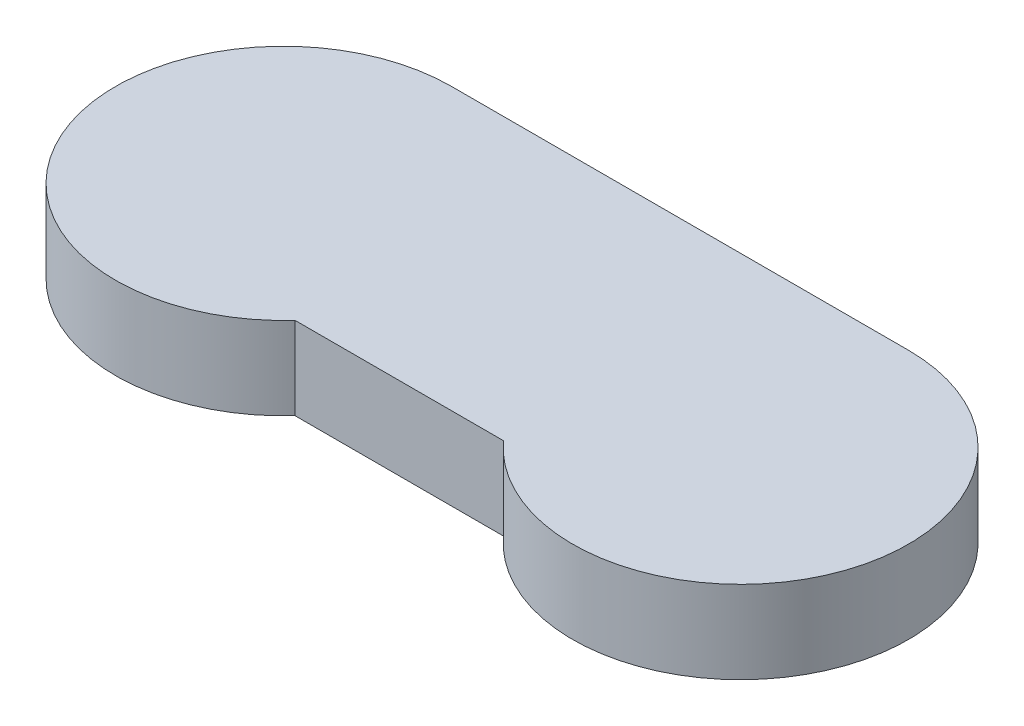
ISO-10303-21;
HEADER;
FILE_DESCRIPTION(('STEP AP214'),'2;1');
FILE_NAME('part.step','',(''),(''),'','','');
FILE_SCHEMA(('AUTOMOTIVE_DESIGN { 1 0 10303 214 1 1 1 1 }'));
ENDSEC;
DATA;
#1=APPLICATION_CONTEXT('core data for automotive mechanical design processes');
#2=APPLICATION_PROTOCOL_DEFINITION('international standard','automotive_design',2000,#1);
#3=PRODUCT_CONTEXT('',#1,'mechanical');
#4=PRODUCT('Part','Part','',(#3));
#5=PRODUCT_RELATED_PRODUCT_CATEGORY('part','',(#4));
#6=PRODUCT_DEFINITION_FORMATION('','',#4);
#7=PRODUCT_DEFINITION_CONTEXT('part definition',#1,'design');
#8=PRODUCT_DEFINITION('design','',#6,#7);
#9=PRODUCT_DEFINITION_SHAPE('','',#8);
#10=(LENGTH_UNIT() NAMED_UNIT(*) SI_UNIT(.MILLI.,.METRE.));
#11=(NAMED_UNIT(*) PLANE_ANGLE_UNIT() SI_UNIT($,.RADIAN.));
#12=(NAMED_UNIT(*) SI_UNIT($,.STERADIAN.) SOLID_ANGLE_UNIT());
#13=UNCERTAINTY_MEASURE_WITH_UNIT(LENGTH_MEASURE(1.E-05),#10,'distance_accuracy_value','');
#14=(GEOMETRIC_REPRESENTATION_CONTEXT(3) GLOBAL_UNCERTAINTY_ASSIGNED_CONTEXT((#13)) GLOBAL_UNIT_ASSIGNED_CONTEXT((#10,
#11,#12)) REPRESENTATION_CONTEXT('',''));
#15=CARTESIAN_POINT('',(0.,0.,0.));
#16=DIRECTION('',(0.,0.,1.));
#17=DIRECTION('',(1.,0.,0.));
#18=AXIS2_PLACEMENT_3D('',#15,#16,#17);
#19=CARTESIAN_POINT('',(-41.5000000000001,0.,0.));
#20=DIRECTION('',(0.,1.,0.));
#21=DIRECTION('',(0.,0.,1.));
#22=AXIS2_PLACEMENT_3D('',#19,#20,#21);
#23=PLANE('',#22);
#24=CARTESIAN_POINT('',(-41.5000000000001,0.,0.));
#25=DIRECTION('',(0.,1.,0.));
#26=DIRECTION('',(0.,0.,1.));
#27=AXIS2_PLACEMENT_3D('',#24,#25,#26);
#28=CIRCLE('',#27,30.5);
#29=CARTESIAN_POINT('',(-41.5000000000001,0.,-30.5));
#30=VERTEX_POINT('',#29);
#31=CARTESIAN_POINT('',(-18.9168204187277,0.,20.5));
#32=VERTEX_POINT('',#31);
#33=EDGE_CURVE('E127',#30,#32,#28,.T.);
#34=ORIENTED_EDGE('',*,*,#33,.F.);
#35=DIRECTION('',(-1.,0.,0.));
#36=VECTOR('',#35,1.);
#37=CARTESIAN_POINT('',(41.4999999999999,0.,-30.5));
#38=LINE('',#37,#36);
#39=CARTESIAN_POINT('',(41.4999999999999,0.,-30.5));
#40=VERTEX_POINT('',#39);
#41=EDGE_CURVE('E78',#40,#30,#38,.T.);
#42=ORIENTED_EDGE('',*,*,#41,.F.);
#43=CARTESIAN_POINT('',(41.4999999999999,0.,0.));
#44=DIRECTION('',(0.,1.,0.));
#45=DIRECTION('',(0.,0.,1.));
#46=AXIS2_PLACEMENT_3D('',#43,#44,#45);
#47=CIRCLE('',#46,30.5);
#48=CARTESIAN_POINT('',(18.9168204187274,0.,20.5));
#49=VERTEX_POINT('',#48);
#50=EDGE_CURVE('E145',#49,#40,#47,.T.);
#51=ORIENTED_EDGE('',*,*,#50,.F.);
#52=DIRECTION('',(1.,0.,0.));
#53=VECTOR('',#52,1.);
#54=CARTESIAN_POINT('',(-18.9168204187277,0.,20.5));
#55=LINE('',#54,#53);
#56=EDGE_CURVE('E131',#32,#49,#55,.T.);
#57=ORIENTED_EDGE('',*,*,#56,.F.);
#58=EDGE_LOOP('',(#34,#42,#51,#57));
#59=FACE_BOUND('',#58,.T.);
#60=CARTESIAN_POINT('',(41.4999999999999,0.,0.));
#61=DIRECTION('',(0.,1.,0.));
#62=DIRECTION('',(0.,0.,1.));
#63=AXIS2_PLACEMENT_3D('',#60,#61,#62);
#64=CIRCLE('',#63,25.5);
#65=CARTESIAN_POINT('',(21.2515432686833,0.,15.5));
#66=VERTEX_POINT('',#65);
#67=CARTESIAN_POINT('',(41.4999999999999,0.,-25.5));
#68=VERTEX_POINT('',#67);
#69=EDGE_CURVE('E48',#66,#68,#64,.T.);
#70=ORIENTED_EDGE('',*,*,#69,.T.);
#71=DIRECTION('',(-1.,0.,0.));
#72=VECTOR('',#71,1.);
#73=CARTESIAN_POINT('',(41.4999999999999,0.,-25.5));
#74=LINE('',#73,#72);
#75=CARTESIAN_POINT('',(-41.5000000000001,0.,-25.5));
#76=VERTEX_POINT('',#75);
#77=EDGE_CURVE('E126',#68,#76,#74,.T.);
#78=ORIENTED_EDGE('',*,*,#77,.T.);
#79=CARTESIAN_POINT('',(-41.5000000000001,0.,0.));
#80=DIRECTION('',(0.,1.,0.));
#81=DIRECTION('',(0.,0.,1.));
#82=AXIS2_PLACEMENT_3D('',#79,#80,#81);
#83=CIRCLE('',#82,25.5);
#84=CARTESIAN_POINT('',(-21.2515432686835,0.,15.5));
#85=VERTEX_POINT('',#84);
#86=EDGE_CURVE('E259',#76,#85,#83,.T.);
#87=ORIENTED_EDGE('',*,*,#86,.T.);
#88=DIRECTION('',(1.,0.,0.));
#89=VECTOR('',#88,1.);
#90=CARTESIAN_POINT('',(-21.2515432686835,0.,15.5));
#91=LINE('',#90,#89);
#92=EDGE_CURVE('E122',#85,#66,#91,.T.);
#93=ORIENTED_EDGE('',*,*,#92,.T.);
#94=EDGE_LOOP('',(#70,#78,#87,#93));
#95=FACE_BOUND('',#94,.T.);
#96=ADVANCED_FACE('F33',(#59,#95),#23,.F.);
#97=CARTESIAN_POINT('',(-41.5000000000001,15.,0.));
#98=DIRECTION('',(0.,-1.,0.));
#99=DIRECTION('',(0.,0.,-1.));
#100=AXIS2_PLACEMENT_3D('',#97,#98,#99);
#101=CYLINDRICAL_SURFACE('',#100,30.5);
#102=ORIENTED_EDGE('',*,*,#33,.T.);
#103=DIRECTION('',(0.,-1.,0.));
#104=VECTOR('',#103,1.);
#105=CARTESIAN_POINT('',(-18.9168204187277,15.,20.5));
#106=LINE('',#105,#104);
#107=CARTESIAN_POINT('',(-18.9168204187277,15.,20.5));
#108=VERTEX_POINT('',#107);
#109=EDGE_CURVE('E11',#108,#32,#106,.T.);
#110=ORIENTED_EDGE('',*,*,#109,.F.);
#111=CARTESIAN_POINT('',(-41.5000000000001,15.,0.));
#112=DIRECTION('',(0.,1.,0.));
#113=DIRECTION('',(0.,0.,1.));
#114=AXIS2_PLACEMENT_3D('',#111,#112,#113);
#115=CIRCLE('',#114,30.5);
#116=CARTESIAN_POINT('',(-41.5000000000001,15.,-30.5));
#117=VERTEX_POINT('',#116);
#118=EDGE_CURVE('E137',#117,#108,#115,.T.);
#119=ORIENTED_EDGE('',*,*,#118,.F.);
#120=DIRECTION('',(0.,-1.,0.));
#121=VECTOR('',#120,1.);
#122=CARTESIAN_POINT('',(-41.5000000000001,15.,-30.5));
#123=LINE('',#122,#121);
#124=EDGE_CURVE('E142',#117,#30,#123,.T.);
#125=ORIENTED_EDGE('',*,*,#124,.T.);
#126=EDGE_LOOP('',(#102,#110,#119,#125));
#127=FACE_BOUND('',#126,.T.);
#128=ADVANCED_FACE('F35',(#127),#101,.T.);
#129=CARTESIAN_POINT('',(-18.9168204187277,15.,20.5));
#130=DIRECTION('',(0.,0.,-1.));
#131=DIRECTION('',(-1.,0.,0.));
#132=AXIS2_PLACEMENT_3D('',#129,#130,#131);
#133=PLANE('',#132);
#134=ORIENTED_EDGE('',*,*,#56,.T.);
#135=DIRECTION('',(0.,-1.,0.));
#136=VECTOR('',#135,1.);
#137=CARTESIAN_POINT('',(18.9168204187274,15.,20.5));
#138=LINE('',#137,#136);
#139=CARTESIAN_POINT('',(18.9168204187274,15.,20.5));
#140=VERTEX_POINT('',#139);
#141=EDGE_CURVE('E41',#140,#49,#138,.T.);
#142=ORIENTED_EDGE('',*,*,#141,.F.);
#143=DIRECTION('',(1.,0.,0.));
#144=VECTOR('',#143,1.);
#145=CARTESIAN_POINT('',(-18.9168204187277,15.,20.5));
#146=LINE('',#145,#144);
#147=EDGE_CURVE('E85',#108,#140,#146,.T.);
#148=ORIENTED_EDGE('',*,*,#147,.F.);
#149=ORIENTED_EDGE('',*,*,#109,.T.);
#150=EDGE_LOOP('',(#134,#142,#148,#149));
#151=FACE_BOUND('',#150,.T.);
#152=ADVANCED_FACE('F171',(#151),#133,.F.);
#153=CARTESIAN_POINT('',(41.4999999999999,15.,0.));
#154=DIRECTION('',(0.,-1.,0.));
#155=DIRECTION('',(0.,0.,-1.));
#156=AXIS2_PLACEMENT_3D('',#153,#154,#155);
#157=CYLINDRICAL_SURFACE('',#156,30.5);
#158=ORIENTED_EDGE('',*,*,#50,.T.);
#159=DIRECTION('',(0.,-1.,0.));
#160=VECTOR('',#159,1.);
#161=CARTESIAN_POINT('',(41.4999999999999,15.,-30.5));
#162=LINE('',#161,#160);
#163=CARTESIAN_POINT('',(41.4999999999999,15.,-30.5));
#164=VERTEX_POINT('',#163);
#165=EDGE_CURVE('E149',#164,#40,#162,.T.);
#166=ORIENTED_EDGE('',*,*,#165,.F.);
#167=CARTESIAN_POINT('',(41.4999999999999,15.,0.));
#168=DIRECTION('',(0.,1.,0.));
#169=DIRECTION('',(0.,0.,1.));
#170=AXIS2_PLACEMENT_3D('',#167,#168,#169);
#171=CIRCLE('',#170,30.5);
#172=EDGE_CURVE('E140',#140,#164,#171,.T.);
#173=ORIENTED_EDGE('',*,*,#172,.F.);
#174=ORIENTED_EDGE('',*,*,#141,.T.);
#175=EDGE_LOOP('',(#158,#166,#173,#174));
#176=FACE_BOUND('',#175,.T.);
#177=ADVANCED_FACE('F154',(#176),#157,.T.);
#178=CARTESIAN_POINT('',(41.4999999999999,15.,-30.5));
#179=DIRECTION('',(0.,0.,1.));
#180=DIRECTION('',(1.,0.,0.));
#181=AXIS2_PLACEMENT_3D('',#178,#179,#180);
#182=PLANE('',#181);
#183=ORIENTED_EDGE('',*,*,#41,.T.);
#184=ORIENTED_EDGE('',*,*,#124,.F.);
#185=DIRECTION('',(-1.,0.,0.));
#186=VECTOR('',#185,1.);
#187=CARTESIAN_POINT('',(41.4999999999999,15.,-30.5));
#188=LINE('',#187,#186);
#189=EDGE_CURVE('E57',#164,#117,#188,.T.);
#190=ORIENTED_EDGE('',*,*,#189,.F.);
#191=ORIENTED_EDGE('',*,*,#165,.T.);
#192=EDGE_LOOP('',(#183,#184,#190,#191));
#193=FACE_BOUND('',#192,.T.);
#194=ADVANCED_FACE('F162',(#193),#182,.F.);
#195=CARTESIAN_POINT('',(-41.5000000000001,15.,0.));
#196=DIRECTION('',(0.,1.,0.));
#197=DIRECTION('',(0.,0.,1.));
#198=AXIS2_PLACEMENT_3D('',#195,#196,#197);
#199=PLANE('',#198);
#200=ORIENTED_EDGE('',*,*,#118,.T.);
#201=ORIENTED_EDGE('',*,*,#147,.T.);
#202=ORIENTED_EDGE('',*,*,#172,.T.);
#203=ORIENTED_EDGE('',*,*,#189,.T.);
#204=EDGE_LOOP('',(#200,#201,#202,#203));
#205=FACE_BOUND('',#204,.T.);
#206=ADVANCED_FACE('F164',(#205),#199,.T.);
#207=CARTESIAN_POINT('',(41.4999999999999,10.,0.));
#208=DIRECTION('',(0.,-1.,0.));
#209=DIRECTION('',(0.,0.,-1.));
#210=AXIS2_PLACEMENT_3D('',#207,#208,#209);
#211=CYLINDRICAL_SURFACE('',#210,25.5);
#212=ORIENTED_EDGE('',*,*,#69,.F.);
#213=DIRECTION('',(0.,-1.,0.));
#214=VECTOR('',#213,1.);
#215=CARTESIAN_POINT('',(21.2515432686833,10.,15.5));
#216=LINE('',#215,#214);
#217=CARTESIAN_POINT('',(21.2515432686833,10.,15.5));
#218=VERTEX_POINT('',#217);
#219=EDGE_CURVE('E121',#218,#66,#216,.T.);
#220=ORIENTED_EDGE('',*,*,#219,.F.);
#221=CARTESIAN_POINT('',(41.4999999999999,10.,0.));
#222=DIRECTION('',(0.,1.,0.));
#223=DIRECTION('',(0.,0.,1.));
#224=AXIS2_PLACEMENT_3D('',#221,#222,#223);
#225=CIRCLE('',#224,25.5);
#226=CARTESIAN_POINT('',(41.4999999999999,10.,-25.5));
#227=VERTEX_POINT('',#226);
#228=EDGE_CURVE('E113',#218,#227,#225,.T.);
#229=ORIENTED_EDGE('',*,*,#228,.T.);
#230=DIRECTION('',(0.,-1.,0.));
#231=VECTOR('',#230,1.);
#232=CARTESIAN_POINT('',(41.4999999999999,10.,-25.5));
#233=LINE('',#232,#231);
#234=EDGE_CURVE('E120',#227,#68,#233,.T.);
#235=ORIENTED_EDGE('',*,*,#234,.T.);
#236=EDGE_LOOP('',(#212,#220,#229,#235));
#237=FACE_BOUND('',#236,.T.);
#238=ADVANCED_FACE('F119',(#237),#211,.F.);
#239=CARTESIAN_POINT('',(41.4999999999999,10.,-25.5));
#240=DIRECTION('',(0.,0.,1.));
#241=DIRECTION('',(1.,0.,0.));
#242=AXIS2_PLACEMENT_3D('',#239,#240,#241);
#243=PLANE('',#242);
#244=ORIENTED_EDGE('',*,*,#77,.F.);
#245=ORIENTED_EDGE('',*,*,#234,.F.);
#246=DIRECTION('',(-1.,0.,0.));
#247=VECTOR('',#246,1.);
#248=CARTESIAN_POINT('',(41.4999999999999,10.,-25.5));
#249=LINE('',#248,#247);
#250=CARTESIAN_POINT('',(-41.5000000000001,10.,-25.5));
#251=VERTEX_POINT('',#250);
#252=EDGE_CURVE('E109',#227,#251,#249,.T.);
#253=ORIENTED_EDGE('',*,*,#252,.T.);
#254=DIRECTION('',(0.,-1.,0.));
#255=VECTOR('',#254,1.);
#256=CARTESIAN_POINT('',(-41.5000000000001,10.,-25.5));
#257=LINE('',#256,#255);
#258=EDGE_CURVE('E128',#251,#76,#257,.T.);
#259=ORIENTED_EDGE('',*,*,#258,.T.);
#260=EDGE_LOOP('',(#244,#245,#253,#259));
#261=FACE_BOUND('',#260,.T.);
#262=ADVANCED_FACE('F124',(#261),#243,.T.);
#263=CARTESIAN_POINT('',(-41.5000000000001,10.,0.));
#264=DIRECTION('',(0.,-1.,0.));
#265=DIRECTION('',(0.,0.,-1.));
#266=AXIS2_PLACEMENT_3D('',#263,#264,#265);
#267=CYLINDRICAL_SURFACE('',#266,25.5);
#268=ORIENTED_EDGE('',*,*,#86,.F.);
#269=ORIENTED_EDGE('',*,*,#258,.F.);
#270=CARTESIAN_POINT('',(-41.5000000000001,10.,0.));
#271=DIRECTION('',(0.,1.,0.));
#272=DIRECTION('',(0.,0.,1.));
#273=AXIS2_PLACEMENT_3D('',#270,#271,#272);
#274=CIRCLE('',#273,25.5);
#275=CARTESIAN_POINT('',(-21.2515432686835,10.,15.5));
#276=VERTEX_POINT('',#275);
#277=EDGE_CURVE('E114',#251,#276,#274,.T.);
#278=ORIENTED_EDGE('',*,*,#277,.T.);
#279=DIRECTION('',(0.,-1.,0.));
#280=VECTOR('',#279,1.);
#281=CARTESIAN_POINT('',(-21.2515432686835,10.,15.5));
#282=LINE('',#281,#280);
#283=EDGE_CURVE('E133',#276,#85,#282,.T.);
#284=ORIENTED_EDGE('',*,*,#283,.T.);
#285=EDGE_LOOP('',(#268,#269,#278,#284));
#286=FACE_BOUND('',#285,.T.);
#287=ADVANCED_FACE('F183',(#286),#267,.F.);
#288=CARTESIAN_POINT('',(-21.2515432686835,10.,15.5));
#289=DIRECTION('',(0.,0.,-1.));
#290=DIRECTION('',(-1.,0.,0.));
#291=AXIS2_PLACEMENT_3D('',#288,#289,#290);
#292=PLANE('',#291);
#293=ORIENTED_EDGE('',*,*,#92,.F.);
#294=ORIENTED_EDGE('',*,*,#283,.F.);
#295=DIRECTION('',(1.,0.,0.));
#296=VECTOR('',#295,1.);
#297=CARTESIAN_POINT('',(-21.2515432686835,10.,15.5));
#298=LINE('',#297,#296);
#299=EDGE_CURVE('E266',#276,#218,#298,.T.);
#300=ORIENTED_EDGE('',*,*,#299,.T.);
#301=ORIENTED_EDGE('',*,*,#219,.T.);
#302=EDGE_LOOP('',(#293,#294,#300,#301));
#303=FACE_BOUND('',#302,.T.);
#304=ADVANCED_FACE('F186',(#303),#292,.T.);
#305=CARTESIAN_POINT('',(41.4999999999999,10.,0.));
#306=DIRECTION('',(0.,1.,0.));
#307=DIRECTION('',(0.,0.,1.));
#308=AXIS2_PLACEMENT_3D('',#305,#306,#307);
#309=PLANE('',#308);
#310=ORIENTED_EDGE('',*,*,#228,.F.);
#311=ORIENTED_EDGE('',*,*,#299,.F.);
#312=ORIENTED_EDGE('',*,*,#277,.F.);
#313=ORIENTED_EDGE('',*,*,#252,.F.);
#314=EDGE_LOOP('',(#310,#311,#312,#313));
#315=FACE_BOUND('',#314,.T.);
#316=ADVANCED_FACE('F111',(#315),#309,.F.);
#317=CLOSED_SHELL('',(#96,#128,#152,#177,#194,#206,#238,#262,#287,#304,#316));
#318=MANIFOLD_SOLID_BREP('B2',#317);
#319=ADVANCED_BREP_SHAPE_REPRESENTATION('',(#18,#318),#14);
#320=SHAPE_DEFINITION_REPRESENTATION(#9,#319);
ENDSEC;
END-ISO-10303-21;
